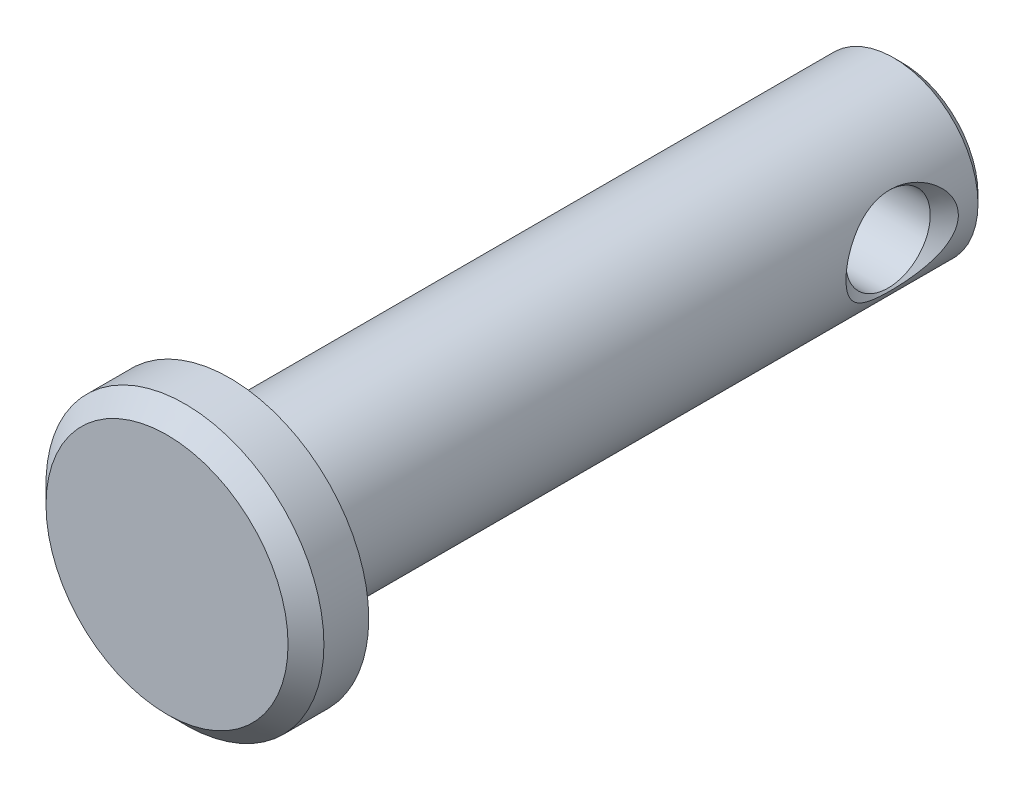
ISO-10303-21;
HEADER;
FILE_DESCRIPTION(('STEP AP214'),'2;1');
FILE_NAME('part.step','',(''),(''),'','','');
FILE_SCHEMA(('AUTOMOTIVE_DESIGN { 1 0 10303 214 1 1 1 1 }'));
ENDSEC;
DATA;
#1=APPLICATION_CONTEXT('core data for automotive mechanical design processes');
#2=APPLICATION_PROTOCOL_DEFINITION('international standard','automotive_design',2000,#1);
#3=PRODUCT_CONTEXT('',#1,'mechanical');
#4=PRODUCT('Part','Part','',(#3));
#5=PRODUCT_RELATED_PRODUCT_CATEGORY('part','',(#4));
#6=PRODUCT_DEFINITION_FORMATION('','',#4);
#7=PRODUCT_DEFINITION_CONTEXT('part definition',#1,'design');
#8=PRODUCT_DEFINITION('design','',#6,#7);
#9=PRODUCT_DEFINITION_SHAPE('','',#8);
#10=(LENGTH_UNIT() NAMED_UNIT(*) SI_UNIT(.MILLI.,.METRE.));
#11=(NAMED_UNIT(*) PLANE_ANGLE_UNIT() SI_UNIT($,.RADIAN.));
#12=(NAMED_UNIT(*) SI_UNIT($,.STERADIAN.) SOLID_ANGLE_UNIT());
#13=UNCERTAINTY_MEASURE_WITH_UNIT(LENGTH_MEASURE(1.E-05),#10,'distance_accuracy_value','');
#14=(GEOMETRIC_REPRESENTATION_CONTEXT(3) GLOBAL_UNCERTAINTY_ASSIGNED_CONTEXT((#13)) GLOBAL_UNIT_ASSIGNED_CONTEXT((#10,
#11,#12)) REPRESENTATION_CONTEXT('',''));
#15=CARTESIAN_POINT('',(0.,0.,0.));
#16=DIRECTION('',(0.,0.,1.));
#17=DIRECTION('',(1.,0.,0.));
#18=AXIS2_PLACEMENT_3D('',#15,#16,#17);
#19=CARTESIAN_POINT('',(0.,0.,10.414));
#20=DIRECTION('',(0.,0.,1.));
#21=DIRECTION('',(1.,0.,0.));
#22=AXIS2_PLACEMENT_3D('',#19,#20,#21);
#23=CYLINDRICAL_SURFACE('',#22,2.3876);
#24=CARTESIAN_POINT('',(-2.28337859995614,-0.69772385360089,-9.34012403643969));
#25=CARTESIAN_POINT('',(-2.26691741490712,-0.751596348279256,-9.29287157601357));
#26=CARTESIAN_POINT('',(-2.24959941107353,-0.801454237534003,-9.24122911052659));
#27=CARTESIAN_POINT('',(-2.21480007248716,-0.893146701929964,-9.13116968961172));
#28=CARTESIAN_POINT('',(-2.19731839346272,-0.934955257821243,-9.07273171281776));
#29=CARTESIAN_POINT('',(-2.16085089970845,-1.01669528998673,-8.94077003863399));
#30=CARTESIAN_POINT('',(-2.14207434398586,-1.05524722865529,-8.86633076462569));
#31=CARTESIAN_POINT('',(-2.10802502223722,-1.12172094233888,-8.71215581731797));
#32=CARTESIAN_POINT('',(-2.0927516124465,-1.14964467109732,-8.63242112062416));
#33=CARTESIAN_POINT('',(-2.06530181539731,-1.19836461812245,-8.45624546466935));
#34=CARTESIAN_POINT('',(-2.05399507337939,-1.21733955405001,-8.35915437478924));
#35=CARTESIAN_POINT('',(-2.04002825095591,-1.24060838208787,-8.16263085668405));
#36=CARTESIAN_POINT('',(-2.03736617085033,-1.24490566947234,-8.06319897529658));
#37=CARTESIAN_POINT('',(-2.04108971826455,-1.23878770268469,-7.8668829829198));
#38=CARTESIAN_POINT('',(-2.04730261228712,-1.22865334330456,-7.76998660914569));
#39=CARTESIAN_POINT('',(-2.06748073808009,-1.19438049996604,-7.57947249763925));
#40=CARTESIAN_POINT('',(-2.08145271125656,-1.17022983724482,-7.48585768636237));
#41=CARTESIAN_POINT('',(-2.11525560959508,-1.1079655713463,-7.30372375422355));
#42=CARTESIAN_POINT('',(-2.13512980335515,-1.0697483340315,-7.21524824621747));
#43=CARTESIAN_POINT('',(-2.17807631943559,-0.979346096456294,-7.04656706230651));
#44=CARTESIAN_POINT('',(-2.2011462592071,-0.927171475214099,-6.96635530243924));
#45=CARTESIAN_POINT('',(-2.24153002923552,-0.823664929651468,-6.8363334390205));
#46=CARTESIAN_POINT('',(-2.25881286277994,-0.775505118267205,-6.78398438015344));
#47=CARTESIAN_POINT('',(-2.29198092459106,-0.671149982358986,-6.68749273428663));
#48=CARTESIAN_POINT('',(-2.3078685593539,-0.614968951028858,-6.64333586457564));
#49=CARTESIAN_POINT('',(-2.33345524405735,-0.507896631202055,-6.57407991307049));
#50=CARTESIAN_POINT('',(-2.34374975847678,-0.458484400206092,-6.54692453246092));
#51=CARTESIAN_POINT('',(-2.36155368816292,-0.355551549097098,-6.50060271235671));
#52=CARTESIAN_POINT('',(-2.36906511510072,-0.302033930347497,-6.48143050122197));
#53=CARTESIAN_POINT('',(-2.38054278597607,-0.191686541778288,-6.45232925933285));
#54=CARTESIAN_POINT('',(-2.38448165870136,-0.134834694911622,-6.44247156840254));
#55=CARTESIAN_POINT('',(-2.38820248029736,-0.020152912122215,-6.43315565134384));
#56=CARTESIAN_POINT('',(-2.38798665541448,0.0376764833949211,-6.4336918557685));
#57=CARTESIAN_POINT('',(-2.38371352774333,0.145235107094246,-6.44439899605605));
#58=CARTESIAN_POINT('',(-2.38011943426558,0.195104909295042,-6.45340823939535));
#59=CARTESIAN_POINT('',(-2.37010766289217,0.292622028885885,-6.47878199802543));
#60=CARTESIAN_POINT('',(-2.36368945911129,0.340268930515066,-6.49514788322862));
#61=CARTESIAN_POINT('',(-2.3482303578055,0.434554683788746,-6.53519989473444));
#62=CARTESIAN_POINT('',(-2.33908215346058,0.481045696474861,-6.55918881958044));
#63=CARTESIAN_POINT('',(-2.31899979023025,0.570052610888456,-6.61304072397446));
#64=CARTESIAN_POINT('',(-2.30806436936141,0.612565670116544,-6.64290785728933));
#65=CARTESIAN_POINT('',(-2.27879606219674,0.71550673212051,-6.72516304047329));
#66=CARTESIAN_POINT('',(-2.25968780658605,0.773019757343865,-6.78093558913214));
#67=CARTESIAN_POINT('',(-2.22101798515377,0.877983177517092,-6.90113641160083));
#68=CARTESIAN_POINT('',(-2.20145559441744,0.925413361039242,-6.96558165586798));
#69=CARTESIAN_POINT('',(-2.16338069041776,1.01126938692588,-7.10243569525568));
#70=CARTESIAN_POINT('',(-2.14489807940647,1.04948977018112,-7.1749811150859));
#71=CARTESIAN_POINT('',(-2.11118900640687,1.1157487290476,-7.32523292623937));
#72=CARTESIAN_POINT('',(-2.09596156231411,1.14379037743484,-7.40293775163807));
#73=CARTESIAN_POINT('',(-2.0679492905468,1.19381716409259,-7.5765949744442));
#74=CARTESIAN_POINT('',(-2.05611168040545,1.21377469466516,-7.67329671018496));
#75=CARTESIAN_POINT('',(-2.04097368829751,1.23906580561487,-7.86924619362503));
#76=CARTESIAN_POINT('',(-2.03767219780854,1.24440128485446,-7.96849360904513));
#77=CARTESIAN_POINT('',(-2.04013158163485,1.24036258345035,-8.16491272422774));
#78=CARTESIAN_POINT('',(-2.04574234791709,1.23123205851527,-8.2620914524932));
#79=CARTESIAN_POINT('',(-2.06484936907968,1.19890595475368,-8.45333726656441));
#80=CARTESIAN_POINT('',(-2.07835184065735,1.17569928688865,-8.5474018373938));
#81=CARTESIAN_POINT('',(-2.11134054081046,1.11537311915895,-8.73029765789376));
#82=CARTESIAN_POINT('',(-2.13085285743712,1.078192803197,-8.81910403823153));
#83=CARTESIAN_POINT('',(-2.17326419862062,0.989925039134745,-8.98866435265038));
#84=CARTESIAN_POINT('',(-2.19616113933521,0.938846131951986,-9.06942319057742));
#85=CARTESIAN_POINT('',(-2.23671260578731,0.836653725108502,-9.20152513470569));
#86=CARTESIAN_POINT('',(-2.25428672692922,0.788574370908413,-9.25524373626904));
#87=CARTESIAN_POINT('',(-2.28813506007192,0.684157574840145,-9.35443385501463));
#88=CARTESIAN_POINT('',(-2.30441151864306,0.627834905788819,-9.39991980637826));
#89=CARTESIAN_POINT('',(-2.33066125403918,0.520565923363511,-9.47127256502926));
#90=CARTESIAN_POINT('',(-2.34123271500379,0.471179227907273,-9.49925369893169));
#91=CARTESIAN_POINT('',(-2.35962282116836,0.368161155605337,-9.54723108773149));
#92=CARTESIAN_POINT('',(-2.36744339788738,0.314532789563737,-9.56723294656416));
#93=CARTESIAN_POINT('',(-2.37954388373416,0.203778773611843,-9.59795853782677));
#94=CARTESIAN_POINT('',(-2.38379508733482,0.146628664343153,-9.60860708018849));
#95=CARTESIAN_POINT('',(-2.38809270699874,0.0311969019319067,-9.61937172939775));
#96=CARTESIAN_POINT('',(-2.38814208625854,-0.027083924797466,-9.61949525866002));
#97=CARTESIAN_POINT('',(-2.38430085478231,-0.135311165876861,-9.60987390371215));
#98=CARTESIAN_POINT('',(-2.38090051161666,-0.185391053200907,-9.60135698512623));
#99=CARTESIAN_POINT('',(-2.37123131251624,-0.283413989324837,-9.57687745726708));
#100=CARTESIAN_POINT('',(-2.36496075751671,-0.331355753957448,-9.56091043768675));
#101=CARTESIAN_POINT('',(-2.34980143749138,-0.425979290801822,-9.52170095709296));
#102=CARTESIAN_POINT('',(-2.3408181437066,-0.472534357539181,-9.49819349820231));
#103=CARTESIAN_POINT('',(-2.32104390773171,-0.561669322920055,-9.44530072538301));
#104=CARTESIAN_POINT('',(-2.3102546519294,-0.604252872886529,-9.41592089009316));
#105=CARTESIAN_POINT('',(-2.29383293398775,-0.662810802191415,-9.36993565710121));
#106=CARTESIAN_POINT('',(-2.28864969466833,-0.680473150143892,-9.35525491514302));
#107=CARTESIAN_POINT('',(-2.28337859995614,-0.69772385360089,-9.34012403643969));
#108=B_SPLINE_CURVE_WITH_KNOTS('',3,(#24,#25,#26,#27,#28,#29,#30,#31,#32,#33,#34,#35,#36,#37,
#38,#39,#40,#41,#42,#43,#44,#45,#46,#47,#48,#49,#50,#51,#52,#53,#54,#55,#56,#57,#58,#59,#60,#61,
#62,#63,#64,#65,#66,#67,#68,#69,#70,#71,#72,#73,#74,#75,#76,#77,#78,#79,#80,#81,#82,#83,#84,#85,
#86,#87,#88,#89,#90,#91,#92,#93,#94,#95,#96,#97,#98,#99,#100,#101,#102,#103,#104,#105,#106,
#107),.UNSPECIFIED.,.T.,.F.,(4,2,2,2,2,2,2,2,2,2,2,2,2,2,2,2,2,2,2,2,2,2,2,2,2,2,2,2,2,2,2,2,2,
2,2,2,2,2,2,2,2,4),(0.,0.220530615567098,0.441762543032666,0.698520520740089,0.955231276783138,
1.25247090687245,1.54964177401189,1.8411069983722,2.13282585676737,2.42673840997979,
2.72043300797783,2.93929995963658,3.15778166515844,3.32906603048532,3.50022634540471,
3.67268719627267,3.84505563857199,3.99677864805122,4.14852992224631,4.3072799691769,
4.46614260035877,4.71187064508171,4.95808671050939,5.20937128139111,5.46057993079197,
5.75745402960906,6.05428957365817,6.34617833277919,6.63829733801357,6.93170270926919,
7.2249281836176,7.44678694250813,7.66825286993891,7.84080959730303,8.01324492186351,
8.1870540683991,8.36074064081127,8.5127809383953,8.66491135513385,8.823115005711,
8.98117174324376,9.05178863735736),.UNSPECIFIED.);
#109=CARTESIAN_POINT('',(-2.28337859995614,-0.69772385360089,-9.34012403643969));
#110=VERTEX_POINT('',#109);
#111=EDGE_CURVE('E53',#110,#110,#108,.T.);
#112=ORIENTED_EDGE('',*,*,#111,.F.);
#113=EDGE_LOOP('',(#112));
#114=FACE_BOUND('',#113,.T.);
#115=CARTESIAN_POINT('',(0.,0.,8.51662));
#116=DIRECTION('',(0.,0.,1.));
#117=DIRECTION('',(1.,0.,0.));
#118=AXIS2_PLACEMENT_3D('',#115,#116,#117);
#119=CIRCLE('',#118,2.3876);
#120=CARTESIAN_POINT('',(2.3876,0.,8.51662));
#121=VERTEX_POINT('',#120);
#122=EDGE_CURVE('E107',#121,#121,#119,.T.);
#123=ORIENTED_EDGE('',*,*,#122,.F.);
#124=EDGE_LOOP('',(#123));
#125=FACE_BOUND('',#124,.T.);
#126=CARTESIAN_POINT('',(0.,0.,-10.17524));
#127=DIRECTION('',(0.,0.,1.));
#128=DIRECTION('',(1.,0.,0.));
#129=AXIS2_PLACEMENT_3D('',#126,#127,#128);
#130=CIRCLE('',#129,2.3876);
#131=CARTESIAN_POINT('',(2.3876,0.,-10.17524));
#132=VERTEX_POINT('',#131);
#133=EDGE_CURVE('E110',#132,#132,#130,.T.);
#134=ORIENTED_EDGE('',*,*,#133,.T.);
#135=EDGE_LOOP('',(#134));
#136=FACE_BOUND('',#135,.T.);
#137=CARTESIAN_POINT('',(2.28337859995614,-0.69772385360089,-9.34012403643969));
#138=CARTESIAN_POINT('',(2.3000340914008,-0.643218839075974,-9.38793129183816));
#139=CARTESIAN_POINT('',(2.31584484743502,-0.584514470065133,-9.4313367899499));
#140=CARTESIAN_POINT('',(2.34388159097725,-0.459269398356442,-9.50644104036371));
#141=CARTESIAN_POINT('',(2.35611666142725,-0.392749163580898,-9.53816950878135));
#142=CARTESIAN_POINT('',(2.37219523919514,-0.275125744073624,-9.57935958729986));
#143=CARTESIAN_POINT('',(2.37746170882288,-0.225555976872133,-9.59266641576913));
#144=CARTESIAN_POINT('',(2.38487426538018,-0.124716951281632,-9.6113285945609));
#145=CARTESIAN_POINT('',(2.38702291119249,-0.0734491219293973,-9.61669046560243));
#146=CARTESIAN_POINT('',(2.38797388475227,0.0293963302956973,-9.61906816336334));
#147=CARTESIAN_POINT('',(2.38677069439177,0.0809743243664616,-9.61607022737411));
#148=CARTESIAN_POINT('',(2.38113743429815,0.182819382582863,-9.60193106365963));
#149=CARTESIAN_POINT('',(2.37670612152814,0.23308593401246,-9.59078669902426));
#150=CARTESIAN_POINT('',(2.36512333917882,0.330464081188634,-9.56129019572274));
#151=CARTESIAN_POINT('',(2.35800303874769,0.377604813024373,-9.54302057228734));
#152=CARTESIAN_POINT('',(2.34162937102826,0.468557262070704,-9.50027209879514));
#153=CARTESIAN_POINT('',(2.33237500796281,0.512367412466417,-9.47579034955502));
#154=CARTESIAN_POINT('',(2.30762088470892,0.616077632732087,-9.40880222249971));
#155=CARTESIAN_POINT('',(2.29123615766345,0.673800424686895,-9.36324468408267));
#156=CARTESIAN_POINT('',(2.25702761971495,0.780789455424665,-9.26350959661335));
#157=CARTESIAN_POINT('',(2.23920041849683,0.830034867608469,-9.20931143115892));
#158=CARTESIAN_POINT('',(2.19881511462067,0.932557661533375,-9.07843156151811));
#159=CARTESIAN_POINT('',(2.17630802676583,0.983202264983368,-8.99967116685053));
#160=CARTESIAN_POINT('',(2.13440885519544,1.07112365965089,-8.83431285934817));
#161=CARTESIAN_POINT('',(2.11501791683739,1.10839554182915,-8.74771208293983));
#162=CARTESIAN_POINT('',(2.08165478719224,1.16986551152502,-8.56811446388541));
#163=CARTESIAN_POINT('',(2.06773090870232,1.19394774636486,-8.47506878367233));
#164=CARTESIAN_POINT('',(2.04754530401552,1.22824892617289,-8.28570859583992));
#165=CARTESIAN_POINT('',(2.0412772426564,1.23847933424197,-8.18939685880021));
#166=CARTESIAN_POINT('',(2.03734450411095,1.24494165478147,-7.99468924455147));
#167=CARTESIAN_POINT('',(2.03980852782919,1.24096415212634,-7.89628361800437));
#168=CARTESIAN_POINT('',(2.05322533487047,1.21863110484577,-7.70165867720518));
#169=CARTESIAN_POINT('',(2.06418418691876,1.20026528106988,-7.6054409766169));
#170=CARTESIAN_POINT('',(2.09274184462461,1.14973499115574,-7.418907287484));
#171=CARTESIAN_POINT('',(2.11026768431124,1.11772164347974,-7.32853879649839));
#172=CARTESIAN_POINT('',(2.14961548653326,1.04003886481032,-7.15483674097237));
#173=CARTESIAN_POINT('',(2.17143699375344,0.994370880861127,-7.0715024321869));
#174=CARTESIAN_POINT('',(2.21240655599048,0.898923621359163,-6.92907884449101));
#175=CARTESIAN_POINT('',(2.23130200909676,0.851469280861662,-6.8683567783823));
#176=CARTESIAN_POINT('',(2.26835868864516,0.74715158649243,-6.75535842821674));
#177=CARTESIAN_POINT('',(2.28652116235094,0.69030513401384,-6.70306730048624));
#178=CARTESIAN_POINT('',(2.31601931763359,0.582250287309877,-6.62101557434781));
#179=CARTESIAN_POINT('',(2.32794198875213,0.53302245892714,-6.58886699823485));
#180=CARTESIAN_POINT('',(2.34921457404524,0.429651701183524,-6.53253487534271));
#181=CARTESIAN_POINT('',(2.35856620964138,0.375512092934974,-6.50834599704798));
#182=CARTESIAN_POINT('',(2.37377637040776,0.262820800583584,-6.46939989119276));
#183=CARTESIAN_POINT('',(2.37960090334825,0.204232121328229,-6.45473434953528));
#184=CARTESIAN_POINT('',(2.38682641235342,0.0850872837382245,-6.4365824249592));
#185=CARTESIAN_POINT('',(2.38823188219088,0.0245331874191838,-6.43308468537704));
#186=CARTESIAN_POINT('',(2.38656420773479,-0.0872266426311225,-6.43725826850175));
#187=CARTESIAN_POINT('',(2.38411431013264,-0.138507840945784,-6.44337514210348));
#188=CARTESIAN_POINT('',(2.37612200233598,-0.239229223623767,-6.46351865475404));
#189=CARTESIAN_POINT('',(2.3705791122399,-0.288669121024934,-6.47754652125785));
#190=CARTESIAN_POINT('',(2.35688510780392,-0.384841986689654,-6.51270697479173));
#191=CARTESIAN_POINT('',(2.34871985655436,-0.431558623150232,-6.53387810252129));
#192=CARTESIAN_POINT('',(2.33043819970735,-0.521339550546726,-6.58222707251523));
#193=CARTESIAN_POINT('',(2.32032061011471,-0.564401602227164,-6.60940856122873));
#194=CARTESIAN_POINT('',(2.29321356104558,-0.66779966767967,-6.68411359677567));
#195=CARTESIAN_POINT('',(2.27537415056411,-0.725567812196602,-6.73489194962229));
#196=CARTESIAN_POINT('',(2.23872719505247,-0.831809511778649,-6.84509371464185));
#197=CARTESIAN_POINT('',(2.21991782006351,-0.880264617488199,-6.90453388496555));
#198=CARTESIAN_POINT('',(2.18268131437929,-0.968966801901577,-7.03135515468991));
#199=CARTESIAN_POINT('',(2.16427111500142,-1.00901485041667,-7.09887959114549));
#200=CARTESIAN_POINT('',(2.12988025694756,-1.07971659119257,-7.23920054268843));
#201=CARTESIAN_POINT('',(2.11389920803759,-1.11037179318464,-7.31199620819252));
#202=CARTESIAN_POINT('',(2.08275279534414,-1.16793730577727,-7.47779680746821));
#203=CARTESIAN_POINT('',(2.06851107532388,-1.19260441307839,-7.57176790125972));
#204=CARTESIAN_POINT('',(2.04782801497675,-1.22778554154442,-7.76315557887998));
#205=CARTESIAN_POINT('',(2.04138597262696,-1.23830083647616,-7.86057185180723));
#206=CARTESIAN_POINT('',(2.03732763570997,-1.24496925845461,-8.05643197576866));
#207=CARTESIAN_POINT('',(2.03974229834851,-1.24107200834696,-8.15487822951585));
#208=CARTESIAN_POINT('',(2.05307349122133,-1.21888610942966,-8.34960698750472));
#209=CARTESIAN_POINT('',(2.06399677328774,-1.20058603144552,-8.44588771088123));
#210=CARTESIAN_POINT('',(2.09250133326694,-1.15017103831032,-8.63256338518546));
#211=CARTESIAN_POINT('',(2.11001038329946,-1.11820549436525,-8.72301014441069));
#212=CARTESIAN_POINT('',(2.14931869724468,-1.04064856144895,-8.89676664158863));
#213=CARTESIAN_POINT('',(2.17111164633853,-0.995077177909047,-8.98008662861724));
#214=CARTESIAN_POINT('',(2.20855377883176,-0.907932869885912,-9.11037954210834));
#215=CARTESIAN_POINT('',(2.22378029847892,-0.870244483381128,-9.16009672860169));
#216=CARTESIAN_POINT('',(2.25400716417628,-0.788657105384184,-9.25434548696764));
#217=CARTESIAN_POINT('',(2.2690073420358,-0.744753725057531,-9.29887335343955));
#218=CARTESIAN_POINT('',(2.28337859995614,-0.69772385360089,-9.34012403643969));
#219=B_SPLINE_CURVE_WITH_KNOTS('',3,(#137,#138,#139,#140,#141,#142,#143,#144,#145,#146,#147,
#148,#149,#150,#151,#152,#153,#154,#155,#156,#157,#158,#159,#160,#161,#162,#163,#164,#165,#166,
#167,#168,#169,#170,#171,#172,#173,#174,#175,#176,#177,#178,#179,#180,#181,#182,#183,#184,#185,
#186,#187,#188,#189,#190,#191,#192,#193,#194,#195,#196,#197,#198,#199,#200,#201,#202,#203,#204,
#205,#206,#207,#208,#209,#210,#211,#212,#213,#214,#215,#216,#217,#218),.UNSPECIFIED.,.T.,.F.,(4,
2,2,2,2,2,2,2,2,2,2,2,2,2,2,2,2,2,2,2,2,2,2,2,2,2,2,2,2,2,2,2,2,2,2,2,2,2,2,2,4),(0.,
0.222935912510033,0.44530050131996,0.599425525766687,0.753423983931093,0.907676118596981,
1.06198768177634,1.21456288165121,1.36720941937186,1.59197466072705,1.81728444354128,
2.10472406306877,2.39226909211697,2.68230087378446,2.97209249219897,3.26617295609241,
3.56046370560218,3.85157713221141,4.14265971912763,4.37987319552433,4.61666435775707,
4.79598113365601,4.97517755505267,5.15607457014154,5.3367875703345,5.49114632046303,
5.64552902720075,5.80075837513813,5.95608215943274,6.19164272328396,6.42766523419278,
6.66876588065022,6.90982775415853,7.20301654639115,7.49617894771831,7.79036702660913,
8.08478879024337,8.37607148931911,8.66692799080798,8.85915271483056,9.05151386544769),.UNSPECIFIED.);
#220=CARTESIAN_POINT('',(2.28337859995614,-0.69772385360089,-9.34012403643969));
#221=VERTEX_POINT('',#220);
#222=EDGE_CURVE('E61',#221,#221,#219,.T.);
#223=ORIENTED_EDGE('',*,*,#222,.F.);
#224=EDGE_LOOP('',(#223));
#225=FACE_BOUND('',#224,.T.);
#226=ADVANCED_FACE('F35',(#114,#125,#136,#225),#23,.T.);
#227=CARTESIAN_POINT('',(0.,0.,-10.414));
#228=DIRECTION('',(0.,0.,1.));
#229=DIRECTION('',(1.,0.,0.));
#230=AXIS2_PLACEMENT_3D('',#227,#228,#229);
#231=PLANE('',#230);
#232=CARTESIAN_POINT('',(0.,0.,-10.414));
#233=DIRECTION('',(0.,0.,1.));
#234=DIRECTION('',(1.,0.,0.));
#235=AXIS2_PLACEMENT_3D('',#232,#233,#234);
#236=CIRCLE('',#235,2.14884);
#237=CARTESIAN_POINT('',(2.14884,0.,-10.414));
#238=VERTEX_POINT('',#237);
#239=EDGE_CURVE('E114',#238,#238,#236,.T.);
#240=ORIENTED_EDGE('',*,*,#239,.F.);
#241=EDGE_LOOP('',(#240));
#242=FACE_BOUND('',#241,.T.);
#243=ADVANCED_FACE('F37',(#242),#231,.F.);
#244=CARTESIAN_POINT('',(0.,3.429,10.414));
#245=DIRECTION('',(0.,0.,-1.));
#246=DIRECTION('',(-1.,0.,0.));
#247=AXIS2_PLACEMENT_3D('',#244,#245,#246);
#248=PLANE('',#247);
#249=CARTESIAN_POINT('',(0.,0.,10.414));
#250=DIRECTION('',(0.,0.,1.));
#251=DIRECTION('',(1.,0.,0.));
#252=AXIS2_PLACEMENT_3D('',#249,#250,#251);
#253=CIRCLE('',#252,3.429);
#254=CARTESIAN_POINT('',(3.429,0.,10.414));
#255=VERTEX_POINT('',#254);
#256=EDGE_CURVE('E10',#255,#255,#253,.T.);
#257=ORIENTED_EDGE('',*,*,#256,.T.);
#258=EDGE_LOOP('',(#257));
#259=FACE_BOUND('',#258,.T.);
#260=ADVANCED_FACE('F101',(#259),#248,.F.);
#261=CARTESIAN_POINT('',(0.,0.,9.906));
#262=DIRECTION('',(0.,0.,-1.));
#263=DIRECTION('',(-1.,0.,0.));
#264=AXIS2_PLACEMENT_3D('',#261,#262,#263);
#265=CONICAL_SURFACE('',#264,3.937,0.785398163397448);
#266=ORIENTED_EDGE('',*,*,#256,.F.);
#267=EDGE_LOOP('',(#266));
#268=FACE_BOUND('',#267,.T.);
#269=CARTESIAN_POINT('',(0.,0.,9.906));
#270=DIRECTION('',(0.,0.,1.));
#271=DIRECTION('',(1.,0.,0.));
#272=AXIS2_PLACEMENT_3D('',#269,#270,#271);
#273=CIRCLE('',#272,3.937);
#274=CARTESIAN_POINT('',(3.937,0.,9.906));
#275=VERTEX_POINT('',#274);
#276=EDGE_CURVE('E43',#275,#275,#273,.T.);
#277=ORIENTED_EDGE('',*,*,#276,.T.);
#278=EDGE_LOOP('',(#277));
#279=FACE_BOUND('',#278,.T.);
#280=ADVANCED_FACE('F135',(#268,#279),#265,.T.);
#281=CARTESIAN_POINT('',(0.,0.,10.414));
#282=DIRECTION('',(0.,0.,1.));
#283=DIRECTION('',(1.,0.,0.));
#284=AXIS2_PLACEMENT_3D('',#281,#282,#283);
#285=CYLINDRICAL_SURFACE('',#284,3.937);
#286=ORIENTED_EDGE('',*,*,#276,.F.);
#287=EDGE_LOOP('',(#286));
#288=FACE_BOUND('',#287,.T.);
#289=CARTESIAN_POINT('',(0.,0.,8.636));
#290=DIRECTION('',(0.,0.,1.));
#291=DIRECTION('',(1.,0.,0.));
#292=AXIS2_PLACEMENT_3D('',#289,#290,#291);
#293=CIRCLE('',#292,3.937);
#294=CARTESIAN_POINT('',(3.937,0.,8.636));
#295=VERTEX_POINT('',#294);
#296=EDGE_CURVE('E48',#295,#295,#293,.T.);
#297=ORIENTED_EDGE('',*,*,#296,.T.);
#298=EDGE_LOOP('',(#297));
#299=FACE_BOUND('',#298,.T.);
#300=ADVANCED_FACE('F125',(#288,#299),#285,.T.);
#301=CARTESIAN_POINT('',(0.,2.50698,8.636));
#302=DIRECTION('',(0.,0.,1.));
#303=DIRECTION('',(1.,0.,0.));
#304=AXIS2_PLACEMENT_3D('',#301,#302,#303);
#305=PLANE('',#304);
#306=ORIENTED_EDGE('',*,*,#296,.F.);
#307=EDGE_LOOP('',(#306));
#308=FACE_BOUND('',#307,.T.);
#309=CARTESIAN_POINT('',(0.,0.,8.636));
#310=DIRECTION('',(0.,0.,1.));
#311=DIRECTION('',(1.,0.,0.));
#312=AXIS2_PLACEMENT_3D('',#309,#310,#311);
#313=CIRCLE('',#312,2.50698);
#314=CARTESIAN_POINT('',(2.50698,0.,8.636));
#315=VERTEX_POINT('',#314);
#316=EDGE_CURVE('E120',#315,#315,#313,.T.);
#317=ORIENTED_EDGE('',*,*,#316,.T.);
#318=EDGE_LOOP('',(#317));
#319=FACE_BOUND('',#318,.T.);
#320=ADVANCED_FACE('F93',(#308,#319),#305,.F.);
#321=CARTESIAN_POINT('',(0.,0.,8.51662));
#322=DIRECTION('',(0.,0.,1.));
#323=DIRECTION('',(1.,0.,0.));
#324=AXIS2_PLACEMENT_3D('',#321,#322,#323);
#325=TOROIDAL_SURFACE('',#324,2.50698,0.11938);
#326=ORIENTED_EDGE('',*,*,#316,.F.);
#327=EDGE_LOOP('',(#326));
#328=FACE_BOUND('',#327,.T.);
#329=ORIENTED_EDGE('',*,*,#122,.T.);
#330=EDGE_LOOP('',(#329));
#331=FACE_BOUND('',#330,.T.);
#332=ADVANCED_FACE('F87',(#328,#331),#325,.F.);
#333=CARTESIAN_POINT('',(0.,0.,-10.414));
#334=DIRECTION('',(0.,0.,1.));
#335=DIRECTION('',(1.,0.,0.));
#336=AXIS2_PLACEMENT_3D('',#333,#334,#335);
#337=CONICAL_SURFACE('',#336,2.14884,0.785398163397446);
#338=ORIENTED_EDGE('',*,*,#133,.F.);
#339=EDGE_LOOP('',(#338));
#340=FACE_BOUND('',#339,.T.);
#341=ORIENTED_EDGE('',*,*,#239,.T.);
#342=EDGE_LOOP('',(#341));
#343=FACE_BOUND('',#342,.T.);
#344=ADVANCED_FACE('F81',(#340,#343),#337,.T.);
#345=CARTESIAN_POINT('',(-2.3876,0.,-8.0264));
#346=DIRECTION('',(-1.,0.,0.));
#347=DIRECTION('',(0.,0.,1.));
#348=AXIS2_PLACEMENT_3D('',#345,#346,#347);
#349=CONICAL_SURFACE('',#348,1.59173333333333,0.785398163397443);
#350=CARTESIAN_POINT('',(-1.98966666666666,0.,-8.0264));
#351=DIRECTION('',(-1.,0.,0.));
#352=DIRECTION('',(0.,0.,1.));
#353=AXIS2_PLACEMENT_3D('',#350,#351,#352);
#354=CIRCLE('',#353,1.1938);
#355=CARTESIAN_POINT('',(-1.98966666666666,0.,-6.8326));
#356=VERTEX_POINT('',#355);
#357=EDGE_CURVE('E51',#356,#356,#354,.F.);
#358=ORIENTED_EDGE('',*,*,#357,.T.);
#359=EDGE_LOOP('',(#358));
#360=FACE_BOUND('',#359,.T.);
#361=ORIENTED_EDGE('',*,*,#111,.T.);
#362=EDGE_LOOP('',(#361));
#363=FACE_BOUND('',#362,.T.);
#364=ADVANCED_FACE('F76',(#360,#363),#349,.F.);
#365=CARTESIAN_POINT('',(0.795866666666648,0.,-8.0264));
#366=DIRECTION('',(1.,0.,0.));
#367=DIRECTION('',(0.,0.,-1.));
#368=AXIS2_PLACEMENT_3D('',#365,#366,#367);
#369=CONICAL_SURFACE('',#368,0.,0.785398163397443);
#370=CARTESIAN_POINT('',(1.98966666666666,0.,-8.0264));
#371=DIRECTION('',(1.,0.,0.));
#372=DIRECTION('',(0.,0.,-1.));
#373=AXIS2_PLACEMENT_3D('',#370,#371,#372);
#374=CIRCLE('',#373,1.1938);
#375=CARTESIAN_POINT('',(1.98966666666666,0.,-9.2202));
#376=VERTEX_POINT('',#375);
#377=EDGE_CURVE('E39',#376,#376,#374,.F.);
#378=ORIENTED_EDGE('',*,*,#377,.T.);
#379=EDGE_LOOP('',(#378));
#380=FACE_BOUND('',#379,.T.);
#381=ORIENTED_EDGE('',*,*,#222,.T.);
#382=EDGE_LOOP('',(#381));
#383=FACE_BOUND('',#382,.T.);
#384=ADVANCED_FACE('F80',(#380,#383),#369,.F.);
#385=CARTESIAN_POINT('',(-3.937,0.,-8.0264));
#386=DIRECTION('',(1.,0.,0.));
#387=DIRECTION('',(0.,0.,-1.));
#388=AXIS2_PLACEMENT_3D('',#385,#386,#387);
#389=CYLINDRICAL_SURFACE('',#388,1.1938);
#390=ORIENTED_EDGE('',*,*,#357,.F.);
#391=EDGE_LOOP('',(#390));
#392=FACE_BOUND('',#391,.T.);
#393=ORIENTED_EDGE('',*,*,#377,.F.);
#394=EDGE_LOOP('',(#393));
#395=FACE_BOUND('',#394,.T.);
#396=ADVANCED_FACE('F83',(#392,#395),#389,.F.);
#397=CLOSED_SHELL('',(#226,#243,#260,#280,#300,#320,#332,#344,#364,#384,#396));
#398=MANIFOLD_SOLID_BREP('B2',#397);
#399=ADVANCED_BREP_SHAPE_REPRESENTATION('',(#18,#398),#14);
#400=SHAPE_DEFINITION_REPRESENTATION(#9,#399);
ENDSEC;
END-ISO-10303-21;
